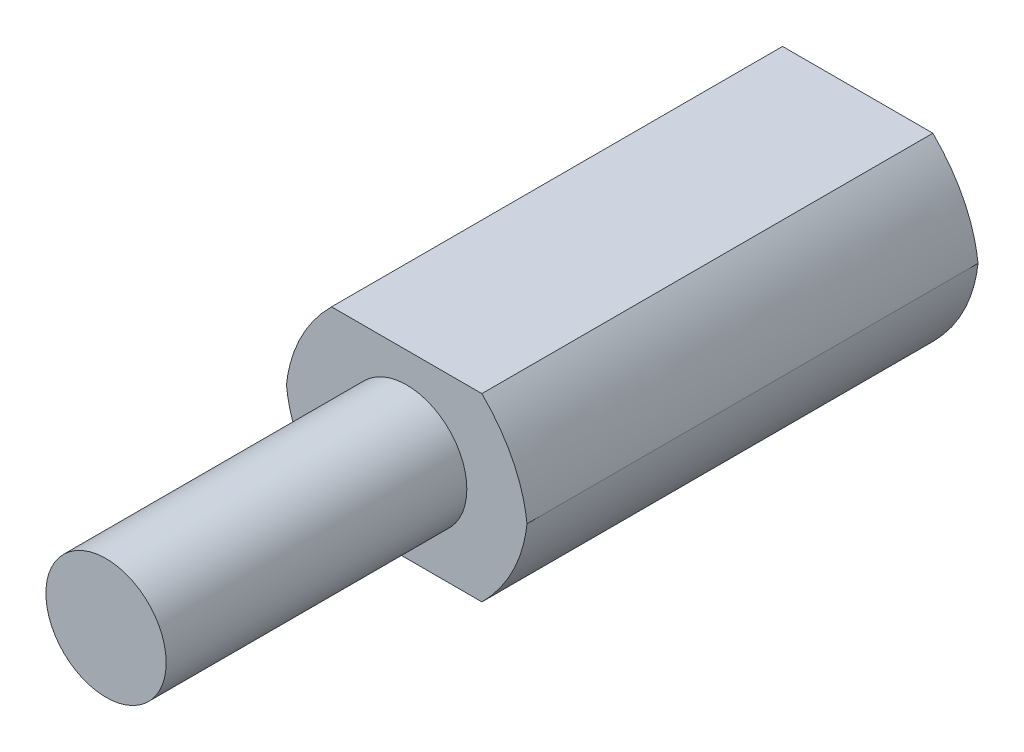
ISO-10303-21;
HEADER;
FILE_DESCRIPTION(('STEP AP214'),'2;1');
FILE_NAME('part.step','',(''),(''),'','','');
FILE_SCHEMA(('AUTOMOTIVE_DESIGN { 1 0 10303 214 1 1 1 1 }'));
ENDSEC;
DATA;
#1=APPLICATION_CONTEXT('core data for automotive mechanical design processes');
#2=APPLICATION_PROTOCOL_DEFINITION('international standard','automotive_design',2000,#1);
#3=PRODUCT_CONTEXT('',#1,'mechanical');
#4=PRODUCT('Part','Part','',(#3));
#5=PRODUCT_RELATED_PRODUCT_CATEGORY('part','',(#4));
#6=PRODUCT_DEFINITION_FORMATION('','',#4);
#7=PRODUCT_DEFINITION_CONTEXT('part definition',#1,'design');
#8=PRODUCT_DEFINITION('design','',#6,#7);
#9=PRODUCT_DEFINITION_SHAPE('','',#8);
#10=(LENGTH_UNIT() NAMED_UNIT(*) SI_UNIT(.MILLI.,.METRE.));
#11=(NAMED_UNIT(*) PLANE_ANGLE_UNIT() SI_UNIT($,.RADIAN.));
#12=(NAMED_UNIT(*) SI_UNIT($,.STERADIAN.) SOLID_ANGLE_UNIT());
#13=UNCERTAINTY_MEASURE_WITH_UNIT(LENGTH_MEASURE(1.E-05),#10,'distance_accuracy_value','');
#14=(GEOMETRIC_REPRESENTATION_CONTEXT(3) GLOBAL_UNCERTAINTY_ASSIGNED_CONTEXT((#13)) GLOBAL_UNIT_ASSIGNED_CONTEXT((#10,
#11,#12)) REPRESENTATION_CONTEXT('',''));
#15=CARTESIAN_POINT('',(0.,0.,0.));
#16=DIRECTION('',(0.,0.,1.));
#17=DIRECTION('',(1.,0.,0.));
#18=AXIS2_PLACEMENT_3D('',#15,#16,#17);
#19=CARTESIAN_POINT('',(0.,0.,15.));
#20=DIRECTION('',(0.,1.,0.));
#21=DIRECTION('',(0.,0.,1.));
#22=AXIS2_PLACEMENT_3D('',#19,#20,#21);
#23=PLANE('',#22);
#24=DIRECTION('',(1.,0.,0.));
#25=VECTOR('',#24,1.);
#26=CARTESIAN_POINT('',(0.,0.,15.));
#27=LINE('',#26,#25);
#28=CARTESIAN_POINT('',(1.5,0.,15.));
#29=VERTEX_POINT('',#28);
#30=CARTESIAN_POINT('',(6.5,0.,15.));
#31=VERTEX_POINT('',#30);
#32=EDGE_CURVE('E42',#29,#31,#27,.T.);
#33=ORIENTED_EDGE('',*,*,#32,.F.);
#34=DIRECTION('',(0.,0.,1.));
#35=VECTOR('',#34,1.);
#36=CARTESIAN_POINT('',(1.5,0.,0.));
#37=LINE('',#36,#35);
#38=CARTESIAN_POINT('',(1.5,0.,0.));
#39=VERTEX_POINT('',#38);
#40=EDGE_CURVE('E97',#39,#29,#37,.T.);
#41=ORIENTED_EDGE('',*,*,#40,.F.);
#42=DIRECTION('',(1.,0.,0.));
#43=VECTOR('',#42,1.);
#44=CARTESIAN_POINT('',(0.,0.,0.));
#45=LINE('',#44,#43);
#46=CARTESIAN_POINT('',(6.5,0.,0.));
#47=VERTEX_POINT('',#46);
#48=EDGE_CURVE('E37',#39,#47,#45,.T.);
#49=ORIENTED_EDGE('',*,*,#48,.T.);
#50=DIRECTION('',(0.,0.,-1.));
#51=VECTOR('',#50,1.);
#52=CARTESIAN_POINT('',(6.5,0.,25.));
#53=LINE('',#52,#51);
#54=EDGE_CURVE('E94',#31,#47,#53,.T.);
#55=ORIENTED_EDGE('',*,*,#54,.F.);
#56=EDGE_LOOP('',(#33,#41,#49,#55));
#57=FACE_BOUND('',#56,.T.);
#58=ADVANCED_FACE('F34',(#57),#23,.F.);
#59=CARTESIAN_POINT('',(0.,0.,15.));
#60=DIRECTION('',(0.,0.,-1.));
#61=DIRECTION('',(-1.,0.,0.));
#62=AXIS2_PLACEMENT_3D('',#59,#60,#61);
#63=PLANE('',#62);
#64=CARTESIAN_POINT('',(1.5,6.,15.));
#65=CARTESIAN_POINT('',(0.480950224357259,4.98605893196943,15.));
#66=CARTESIAN_POINT('',(0.0936839770399062,3.88414597675041,15.));
#67=CARTESIAN_POINT('',(0.,3.,15.));
#68=B_SPLINE_CURVE_WITH_KNOTS('',3,(#64,#65,#66,#67),.UNSPECIFIED.,.F.,.F.,(4,4),(0.,1.),.UNSPECIFIED.);
#69=CARTESIAN_POINT('',(1.5,6.,15.));
#70=VERTEX_POINT('',#69);
#71=CARTESIAN_POINT('',(0.,3.,15.));
#72=VERTEX_POINT('',#71);
#73=EDGE_CURVE('E287',#70,#72,#68,.T.);
#74=ORIENTED_EDGE('',*,*,#73,.T.);
#75=CARTESIAN_POINT('',(1.5,0.,15.));
#76=CARTESIAN_POINT('',(0.480950224357259,1.01394106803057,15.));
#77=CARTESIAN_POINT('',(0.0936839770399062,2.11585402324959,15.));
#78=CARTESIAN_POINT('',(0.,3.,15.));
#79=B_SPLINE_CURVE_WITH_KNOTS('',3,(#75,#76,#77,#78),.UNSPECIFIED.,.F.,.F.,(4,4),(0.,1.),.UNSPECIFIED.);
#80=EDGE_CURVE('E136',#29,#72,#79,.T.);
#81=ORIENTED_EDGE('',*,*,#80,.F.);
#82=ORIENTED_EDGE('',*,*,#32,.T.);
#83=CARTESIAN_POINT('',(6.5,0.,15.));
#84=CARTESIAN_POINT('',(7.51904977564274,1.01394106803057,15.));
#85=CARTESIAN_POINT('',(7.90631602296009,2.11585402324959,15.));
#86=CARTESIAN_POINT('',(8.,3.,15.));
#87=B_SPLINE_CURVE_WITH_KNOTS('',3,(#83,#84,#85,#86),.UNSPECIFIED.,.F.,.F.,(4,4),(0.,1.),.UNSPECIFIED.);
#88=CARTESIAN_POINT('',(8.,3.,15.));
#89=VERTEX_POINT('',#88);
#90=EDGE_CURVE('E174',#31,#89,#87,.T.);
#91=ORIENTED_EDGE('',*,*,#90,.T.);
#92=CARTESIAN_POINT('',(6.5,6.,15.));
#93=CARTESIAN_POINT('',(7.51904977564274,4.98605893196943,15.));
#94=CARTESIAN_POINT('',(7.90631602296009,3.88414597675041,15.));
#95=CARTESIAN_POINT('',(8.,3.,15.));
#96=B_SPLINE_CURVE_WITH_KNOTS('',3,(#92,#93,#94,#95),.UNSPECIFIED.,.F.,.F.,(4,4),(0.,1.),.UNSPECIFIED.);
#97=CARTESIAN_POINT('',(6.5,6.,15.));
#98=VERTEX_POINT('',#97);
#99=EDGE_CURVE('E105',#98,#89,#96,.T.);
#100=ORIENTED_EDGE('',*,*,#99,.F.);
#101=DIRECTION('',(1.,0.,0.));
#102=VECTOR('',#101,1.);
#103=CARTESIAN_POINT('',(0.,6.,15.));
#104=LINE('',#103,#102);
#105=EDGE_CURVE('E130',#70,#98,#104,.T.);
#106=ORIENTED_EDGE('',*,*,#105,.F.);
#107=EDGE_LOOP('',(#74,#81,#82,#91,#100,#106));
#108=FACE_BOUND('',#107,.T.);
#109=CARTESIAN_POINT('',(4.,3.,15.));
#110=DIRECTION('',(0.,0.,1.));
#111=DIRECTION('',(1.,0.,0.));
#112=AXIS2_PLACEMENT_3D('',#109,#110,#111);
#113=CIRCLE('',#112,2.);
#114=CARTESIAN_POINT('',(6.,3.,15.));
#115=VERTEX_POINT('',#114);
#116=EDGE_CURVE('E11',#115,#115,#113,.T.);
#117=ORIENTED_EDGE('',*,*,#116,.F.);
#118=EDGE_LOOP('',(#117));
#119=FACE_BOUND('',#118,.T.);
#120=ADVANCED_FACE('F187',(#108,#119),#63,.F.);
#121=CARTESIAN_POINT('',(0.,0.,0.));
#122=DIRECTION('',(0.,0.,-1.));
#123=DIRECTION('',(-1.,0.,0.));
#124=AXIS2_PLACEMENT_3D('',#121,#122,#123);
#125=PLANE('',#124);
#126=CARTESIAN_POINT('',(1.5,0.,0.));
#127=CARTESIAN_POINT('',(0.480950224357259,1.01394106803057,0.));
#128=CARTESIAN_POINT('',(0.0936839770399062,2.11585402324959,0.));
#129=CARTESIAN_POINT('',(0.,3.,0.));
#130=B_SPLINE_CURVE_WITH_KNOTS('',3,(#126,#127,#128,#129),.UNSPECIFIED.,.F.,.F.,(4,4),(0.,1.),.UNSPECIFIED.);
#131=CARTESIAN_POINT('',(0.,3.,0.));
#132=VERTEX_POINT('',#131);
#133=EDGE_CURVE('E138',#39,#132,#130,.T.);
#134=ORIENTED_EDGE('',*,*,#133,.T.);
#135=CARTESIAN_POINT('',(1.5,6.,0.));
#136=CARTESIAN_POINT('',(0.480950224357259,4.98605893196943,0.));
#137=CARTESIAN_POINT('',(0.0936839770399062,3.88414597675041,0.));
#138=CARTESIAN_POINT('',(0.,3.,0.));
#139=B_SPLINE_CURVE_WITH_KNOTS('',3,(#135,#136,#137,#138),.UNSPECIFIED.,.F.,.F.,(4,4),(0.,1.),.UNSPECIFIED.);
#140=CARTESIAN_POINT('',(1.5,6.,0.));
#141=VERTEX_POINT('',#140);
#142=EDGE_CURVE('E281',#141,#132,#139,.T.);
#143=ORIENTED_EDGE('',*,*,#142,.F.);
#144=DIRECTION('',(1.,0.,0.));
#145=VECTOR('',#144,1.);
#146=CARTESIAN_POINT('',(0.,6.,0.));
#147=LINE('',#146,#145);
#148=CARTESIAN_POINT('',(6.5,6.,0.));
#149=VERTEX_POINT('',#148);
#150=EDGE_CURVE('E110',#141,#149,#147,.T.);
#151=ORIENTED_EDGE('',*,*,#150,.T.);
#152=CARTESIAN_POINT('',(6.5,6.,0.));
#153=CARTESIAN_POINT('',(7.51904977564274,4.98605893196943,0.));
#154=CARTESIAN_POINT('',(7.90631602296009,3.88414597675041,0.));
#155=CARTESIAN_POINT('',(8.,3.,0.));
#156=B_SPLINE_CURVE_WITH_KNOTS('',3,(#152,#153,#154,#155),.UNSPECIFIED.,.F.,.F.,(4,4),(0.,1.),.UNSPECIFIED.);
#157=CARTESIAN_POINT('',(8.,3.,0.));
#158=VERTEX_POINT('',#157);
#159=EDGE_CURVE('E103',#149,#158,#156,.T.);
#160=ORIENTED_EDGE('',*,*,#159,.T.);
#161=CARTESIAN_POINT('',(6.5,0.,0.));
#162=CARTESIAN_POINT('',(7.51904977564274,1.01394106803057,0.));
#163=CARTESIAN_POINT('',(7.90631602296009,2.11585402324959,0.));
#164=CARTESIAN_POINT('',(8.,3.,0.));
#165=B_SPLINE_CURVE_WITH_KNOTS('',3,(#161,#162,#163,#164),.UNSPECIFIED.,.F.,.F.,(4,4),(0.,1.),.UNSPECIFIED.);
#166=EDGE_CURVE('E88',#47,#158,#165,.T.);
#167=ORIENTED_EDGE('',*,*,#166,.F.);
#168=ORIENTED_EDGE('',*,*,#48,.F.);
#169=EDGE_LOOP('',(#134,#143,#151,#160,#167,#168));
#170=FACE_BOUND('',#169,.T.);
#171=ADVANCED_FACE('F108',(#170),#125,.T.);
#172=CARTESIAN_POINT('',(4.,3.,25.));
#173=DIRECTION('',(0.,0.,-1.));
#174=DIRECTION('',(-1.,0.,0.));
#175=AXIS2_PLACEMENT_3D('',#172,#173,#174);
#176=CYLINDRICAL_SURFACE('',#175,2.);
#177=ORIENTED_EDGE('',*,*,#116,.T.);
#178=EDGE_LOOP('',(#177));
#179=FACE_BOUND('',#178,.T.);
#180=CARTESIAN_POINT('',(4.,3.,25.));
#181=DIRECTION('',(0.,0.,1.));
#182=DIRECTION('',(1.,0.,0.));
#183=AXIS2_PLACEMENT_3D('',#180,#181,#182);
#184=CIRCLE('',#183,2.);
#185=CARTESIAN_POINT('',(6.,3.,25.));
#186=VERTEX_POINT('',#185);
#187=EDGE_CURVE('E178',#186,#186,#184,.T.);
#188=ORIENTED_EDGE('',*,*,#187,.F.);
#189=EDGE_LOOP('',(#188));
#190=FACE_BOUND('',#189,.T.);
#191=ADVANCED_FACE('F197',(#179,#190),#176,.T.);
#192=CARTESIAN_POINT('',(4.,3.,25.));
#193=DIRECTION('',(0.,0.,1.));
#194=DIRECTION('',(1.,0.,0.));
#195=AXIS2_PLACEMENT_3D('',#192,#193,#194);
#196=PLANE('',#195);
#197=ORIENTED_EDGE('',*,*,#187,.T.);
#198=EDGE_LOOP('',(#197));
#199=FACE_BOUND('',#198,.T.);
#200=ADVANCED_FACE('F159',(#199),#196,.T.);
#201=CARTESIAN_POINT('',(6.5,0.,25.));
#202=CARTESIAN_POINT('',(7.51904977564274,1.01394106803057,25.));
#203=CARTESIAN_POINT('',(7.90631602296009,2.11585402324959,25.));
#204=CARTESIAN_POINT('',(8.,3.,25.));
#205=B_SPLINE_CURVE_WITH_KNOTS('',3,(#201,#202,#203,#204),.UNSPECIFIED.,.F.,.F.,(4,4),(0.,1.),.UNSPECIFIED.);
#206=DIRECTION('',(0.,0.,-1.));
#207=VECTOR('',#206,1.);
#208=SURFACE_OF_LINEAR_EXTRUSION('',#205,#207);
#209=ORIENTED_EDGE('',*,*,#54,.T.);
#210=ORIENTED_EDGE('',*,*,#166,.T.);
#211=DIRECTION('',(0.,0.,-1.));
#212=VECTOR('',#211,1.);
#213=CARTESIAN_POINT('',(8.,3.,25.));
#214=LINE('',#213,#212);
#215=EDGE_CURVE('E92',#89,#158,#214,.T.);
#216=ORIENTED_EDGE('',*,*,#215,.F.);
#217=ORIENTED_EDGE('',*,*,#90,.F.);
#218=EDGE_LOOP('',(#209,#210,#216,#217));
#219=FACE_BOUND('',#218,.T.);
#220=ADVANCED_FACE('F90',(#219),#208,.F.);
#221=DIRECTION('',(0.,0.,1.));
#222=VECTOR('',#221,1.);
#223=SURFACE_OF_LINEAR_EXTRUSION('',#130,#222);
#224=ORIENTED_EDGE('',*,*,#80,.T.);
#225=DIRECTION('',(0.,0.,1.));
#226=VECTOR('',#225,1.);
#227=CARTESIAN_POINT('',(0.,3.,0.));
#228=LINE('',#227,#226);
#229=EDGE_CURVE('E50',#132,#72,#228,.T.);
#230=ORIENTED_EDGE('',*,*,#229,.F.);
#231=ORIENTED_EDGE('',*,*,#133,.F.);
#232=ORIENTED_EDGE('',*,*,#40,.T.);
#233=EDGE_LOOP('',(#224,#230,#231,#232));
#234=FACE_BOUND('',#233,.T.);
#235=ADVANCED_FACE('F150',(#234),#223,.F.);
#236=CARTESIAN_POINT('',(0.,6.,15.));
#237=DIRECTION('',(0.,-1.,0.));
#238=DIRECTION('',(0.,0.,1.));
#239=AXIS2_PLACEMENT_3D('',#236,#237,#238);
#240=PLANE('',#239);
#241=ORIENTED_EDGE('',*,*,#105,.T.);
#242=DIRECTION('',(0.,0.,-1.));
#243=VECTOR('',#242,1.);
#244=CARTESIAN_POINT('',(6.5,6.,25.));
#245=LINE('',#244,#243);
#246=EDGE_CURVE('E106',#98,#149,#245,.T.);
#247=ORIENTED_EDGE('',*,*,#246,.T.);
#248=ORIENTED_EDGE('',*,*,#150,.F.);
#249=DIRECTION('',(0.,0.,1.));
#250=VECTOR('',#249,1.);
#251=CARTESIAN_POINT('',(1.5,6.,0.));
#252=LINE('',#251,#250);
#253=EDGE_CURVE('E114',#141,#70,#252,.T.);
#254=ORIENTED_EDGE('',*,*,#253,.T.);
#255=EDGE_LOOP('',(#241,#247,#248,#254));
#256=FACE_BOUND('',#255,.T.);
#257=ADVANCED_FACE('F154',(#256),#240,.F.);
#258=CARTESIAN_POINT('',(6.5,6.,25.));
#259=CARTESIAN_POINT('',(7.51904977564274,4.98605893196943,25.));
#260=CARTESIAN_POINT('',(7.90631602296009,3.88414597675041,25.));
#261=CARTESIAN_POINT('',(8.,3.,25.));
#262=B_SPLINE_CURVE_WITH_KNOTS('',3,(#258,#259,#260,#261),.UNSPECIFIED.,.F.,.F.,(4,4),(0.,1.),.UNSPECIFIED.);
#263=DIRECTION('',(0.,0.,-1.));
#264=VECTOR('',#263,1.);
#265=SURFACE_OF_LINEAR_EXTRUSION('',#262,#264);
#266=ORIENTED_EDGE('',*,*,#246,.F.);
#267=ORIENTED_EDGE('',*,*,#99,.T.);
#268=ORIENTED_EDGE('',*,*,#215,.T.);
#269=ORIENTED_EDGE('',*,*,#159,.F.);
#270=EDGE_LOOP('',(#266,#267,#268,#269));
#271=FACE_BOUND('',#270,.T.);
#272=ADVANCED_FACE('F102',(#271),#265,.T.);
#273=DIRECTION('',(0.,0.,1.));
#274=VECTOR('',#273,1.);
#275=SURFACE_OF_LINEAR_EXTRUSION('',#139,#274);
#276=ORIENTED_EDGE('',*,*,#73,.F.);
#277=ORIENTED_EDGE('',*,*,#253,.F.);
#278=ORIENTED_EDGE('',*,*,#142,.T.);
#279=ORIENTED_EDGE('',*,*,#229,.T.);
#280=EDGE_LOOP('',(#276,#277,#278,#279));
#281=FACE_BOUND('',#280,.T.);
#282=ADVANCED_FACE('F229',(#281),#275,.T.);
#283=CLOSED_SHELL('',(#58,#120,#171,#191,#200,#220,#235,#257,#272,#282));
#284=MANIFOLD_SOLID_BREP('B2',#283);
#285=ADVANCED_BREP_SHAPE_REPRESENTATION('',(#18,#284),#14);
#286=SHAPE_DEFINITION_REPRESENTATION(#9,#285);
ENDSEC;
END-ISO-10303-21;
